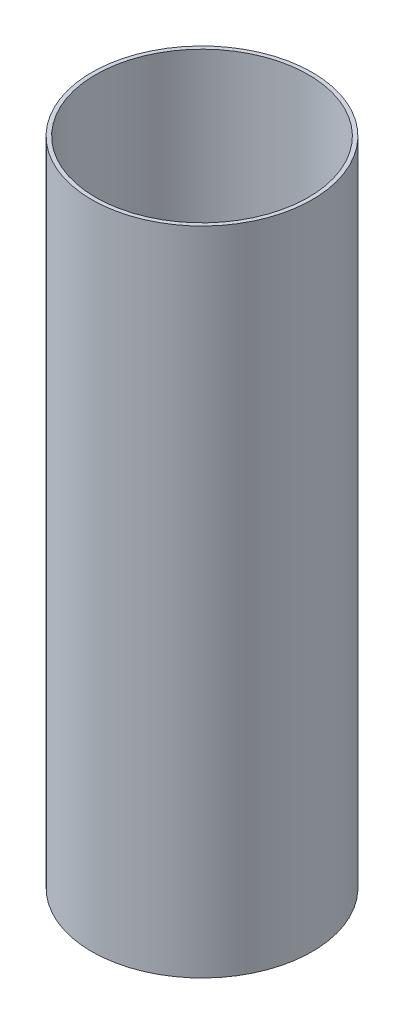
ISO-10303-21;
HEADER;
FILE_DESCRIPTION(('STEP AP214'),'2;1');
FILE_NAME('part.step','',(''),(''),'','','');
FILE_SCHEMA(('AUTOMOTIVE_DESIGN { 1 0 10303 214 1 1 1 1 }'));
ENDSEC;
DATA;
#1=APPLICATION_CONTEXT('core data for automotive mechanical design processes');
#2=APPLICATION_PROTOCOL_DEFINITION('international standard','automotive_design',2000,#1);
#3=PRODUCT_CONTEXT('',#1,'mechanical');
#4=PRODUCT('Part','Part','',(#3));
#5=PRODUCT_RELATED_PRODUCT_CATEGORY('part','',(#4));
#6=PRODUCT_DEFINITION_FORMATION('','',#4);
#7=PRODUCT_DEFINITION_CONTEXT('part definition',#1,'design');
#8=PRODUCT_DEFINITION('design','',#6,#7);
#9=PRODUCT_DEFINITION_SHAPE('','',#8);
#10=(LENGTH_UNIT() NAMED_UNIT(*) SI_UNIT(.MILLI.,.METRE.));
#11=(NAMED_UNIT(*) PLANE_ANGLE_UNIT() SI_UNIT($,.RADIAN.));
#12=(NAMED_UNIT(*) SI_UNIT($,.STERADIAN.) SOLID_ANGLE_UNIT());
#13=UNCERTAINTY_MEASURE_WITH_UNIT(LENGTH_MEASURE(1.E-05),#10,'distance_accuracy_value','');
#14=(GEOMETRIC_REPRESENTATION_CONTEXT(3) GLOBAL_UNCERTAINTY_ASSIGNED_CONTEXT((#13)) GLOBAL_UNIT_ASSIGNED_CONTEXT((#10,
#11,#12)) REPRESENTATION_CONTEXT('',''));
#15=CARTESIAN_POINT('',(0.,0.,0.));
#16=DIRECTION('',(0.,0.,1.));
#17=DIRECTION('',(1.,0.,0.));
#18=AXIS2_PLACEMENT_3D('',#15,#16,#17);
#19=CARTESIAN_POINT('',(0.,300.,0.));
#20=DIRECTION('',(0.,1.,0.));
#21=DIRECTION('',(0.,0.,1.));
#22=AXIS2_PLACEMENT_3D('',#19,#20,#21);
#23=PLANE('',#22);
#24=CARTESIAN_POINT('',(0.,300.,0.));
#25=DIRECTION('',(0.,1.,0.));
#26=DIRECTION('',(0.,0.,1.));
#27=AXIS2_PLACEMENT_3D('',#24,#25,#26);
#28=CIRCLE('',#27,50.8);
#29=CARTESIAN_POINT('',(0.,300.,50.8));
#30=VERTEX_POINT('',#29);
#31=EDGE_CURVE('E10',#30,#30,#28,.T.);
#32=ORIENTED_EDGE('',*,*,#31,.T.);
#33=EDGE_LOOP('',(#32));
#34=FACE_BOUND('',#33,.T.);
#35=CARTESIAN_POINT('',(0.,300.,0.));
#36=DIRECTION('',(0.,1.,0.));
#37=DIRECTION('',(0.,0.,1.));
#38=AXIS2_PLACEMENT_3D('',#35,#36,#37);
#39=CIRCLE('',#38,49.);
#40=CARTESIAN_POINT('',(0.,300.,49.));
#41=VERTEX_POINT('',#40);
#42=EDGE_CURVE('E42',#41,#41,#39,.T.);
#43=ORIENTED_EDGE('',*,*,#42,.F.);
#44=EDGE_LOOP('',(#43));
#45=FACE_BOUND('',#44,.T.);
#46=ADVANCED_FACE('F31',(#34,#45),#23,.T.);
#47=CARTESIAN_POINT('',(0.,0.,0.));
#48=DIRECTION('',(0.,1.,0.));
#49=DIRECTION('',(0.,0.,1.));
#50=AXIS2_PLACEMENT_3D('',#47,#48,#49);
#51=PLANE('',#50);
#52=CARTESIAN_POINT('',(0.,0.,0.));
#53=DIRECTION('',(0.,1.,0.));
#54=DIRECTION('',(0.,0.,1.));
#55=AXIS2_PLACEMENT_3D('',#52,#53,#54);
#56=CIRCLE('',#55,50.8);
#57=CARTESIAN_POINT('',(0.,0.,50.8));
#58=VERTEX_POINT('',#57);
#59=EDGE_CURVE('E35',#58,#58,#56,.T.);
#60=ORIENTED_EDGE('',*,*,#59,.F.);
#61=EDGE_LOOP('',(#60));
#62=FACE_BOUND('',#61,.T.);
#63=CARTESIAN_POINT('',(0.,0.,0.));
#64=DIRECTION('',(0.,1.,0.));
#65=DIRECTION('',(0.,0.,1.));
#66=AXIS2_PLACEMENT_3D('',#63,#64,#65);
#67=CIRCLE('',#66,49.);
#68=CARTESIAN_POINT('',(0.,0.,49.));
#69=VERTEX_POINT('',#68);
#70=EDGE_CURVE('E44',#69,#69,#67,.T.);
#71=ORIENTED_EDGE('',*,*,#70,.T.);
#72=EDGE_LOOP('',(#71));
#73=FACE_BOUND('',#72,.T.);
#74=ADVANCED_FACE('F54',(#62,#73),#51,.F.);
#75=CARTESIAN_POINT('',(0.,300.,0.));
#76=DIRECTION('',(0.,-1.,0.));
#77=DIRECTION('',(0.,0.,-1.));
#78=AXIS2_PLACEMENT_3D('',#75,#76,#77);
#79=CYLINDRICAL_SURFACE('',#78,50.8);
#80=ORIENTED_EDGE('',*,*,#31,.F.);
#81=EDGE_LOOP('',(#80));
#82=FACE_BOUND('',#81,.T.);
#83=ORIENTED_EDGE('',*,*,#59,.T.);
#84=EDGE_LOOP('',(#83));
#85=FACE_BOUND('',#84,.T.);
#86=ADVANCED_FACE('F33',(#82,#85),#79,.T.);
#87=CARTESIAN_POINT('',(0.,300.,0.));
#88=DIRECTION('',(0.,-1.,0.));
#89=DIRECTION('',(0.,0.,-1.));
#90=AXIS2_PLACEMENT_3D('',#87,#88,#89);
#91=CYLINDRICAL_SURFACE('',#90,49.);
#92=ORIENTED_EDGE('',*,*,#42,.T.);
#93=EDGE_LOOP('',(#92));
#94=FACE_BOUND('',#93,.T.);
#95=ORIENTED_EDGE('',*,*,#70,.F.);
#96=EDGE_LOOP('',(#95));
#97=FACE_BOUND('',#96,.T.);
#98=ADVANCED_FACE('F50',(#94,#97),#91,.F.);
#99=CLOSED_SHELL('',(#46,#74,#86,#98));
#100=MANIFOLD_SOLID_BREP('B2',#99);
#101=ADVANCED_BREP_SHAPE_REPRESENTATION('',(#18,#100),#14);
#102=SHAPE_DEFINITION_REPRESENTATION(#9,#101);
ENDSEC;
END-ISO-10303-21;
